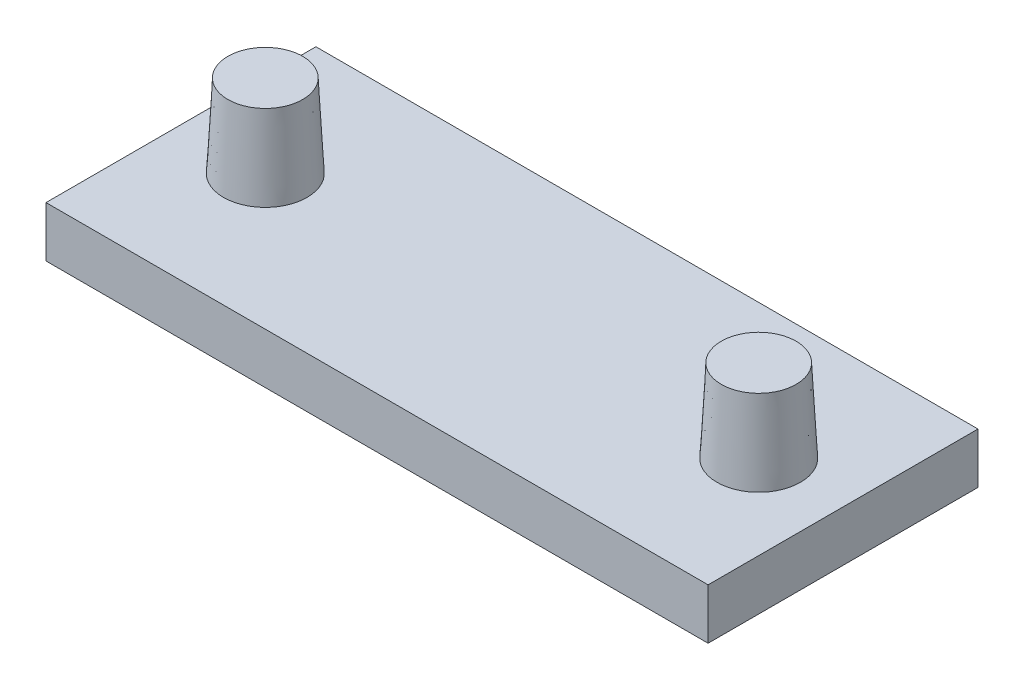
ISO-10303-21;
HEADER;
FILE_DESCRIPTION(('STEP AP214'),'2;1');
FILE_NAME('part.step','',(''),(''),'','','');
FILE_SCHEMA(('AUTOMOTIVE_DESIGN { 1 0 10303 214 1 1 1 1 }'));
ENDSEC;
DATA;
#1=APPLICATION_CONTEXT('core data for automotive mechanical design processes');
#2=APPLICATION_PROTOCOL_DEFINITION('international standard','automotive_design',2000,#1);
#3=PRODUCT_CONTEXT('',#1,'mechanical');
#4=PRODUCT('Part','Part','',(#3));
#5=PRODUCT_RELATED_PRODUCT_CATEGORY('part','',(#4));
#6=PRODUCT_DEFINITION_FORMATION('','',#4);
#7=PRODUCT_DEFINITION_CONTEXT('part definition',#1,'design');
#8=PRODUCT_DEFINITION('design','',#6,#7);
#9=PRODUCT_DEFINITION_SHAPE('','',#8);
#10=(LENGTH_UNIT() NAMED_UNIT(*) SI_UNIT(.MILLI.,.METRE.));
#11=(NAMED_UNIT(*) PLANE_ANGLE_UNIT() SI_UNIT($,.RADIAN.));
#12=(NAMED_UNIT(*) SI_UNIT($,.STERADIAN.) SOLID_ANGLE_UNIT());
#13=UNCERTAINTY_MEASURE_WITH_UNIT(LENGTH_MEASURE(1.E-05),#10,'distance_accuracy_value','');
#14=(GEOMETRIC_REPRESENTATION_CONTEXT(3) GLOBAL_UNCERTAINTY_ASSIGNED_CONTEXT((#13)) GLOBAL_UNIT_ASSIGNED_CONTEXT((#10,
#11,#12)) REPRESENTATION_CONTEXT('',''));
#15=CARTESIAN_POINT('',(0.,0.,0.));
#16=DIRECTION('',(0.,0.,1.));
#17=DIRECTION('',(1.,0.,0.));
#18=AXIS2_PLACEMENT_3D('',#15,#16,#17);
#19=CARTESIAN_POINT('',(-4.17338691038083,3.,2.89774806999235));
#20=DIRECTION('',(1.,0.,0.));
#21=DIRECTION('',(0.,0.,-1.));
#22=AXIS2_PLACEMENT_3D('',#19,#20,#21);
#23=PLANE('',#22);
#24=DIRECTION('',(0.,0.,1.));
#25=VECTOR('',#24,1.);
#26=CARTESIAN_POINT('',(-4.17338691038083,0.,2.89774806999235));
#27=LINE('',#26,#25);
#28=CARTESIAN_POINT('',(-4.17338691038083,0.,-13.1022519300077));
#29=VERTEX_POINT('',#28);
#30=CARTESIAN_POINT('',(-4.17338691038083,0.,2.89774806999235));
#31=VERTEX_POINT('',#30);
#32=EDGE_CURVE('E101',#29,#31,#27,.T.);
#33=ORIENTED_EDGE('',*,*,#32,.T.);
#34=DIRECTION('',(0.,-1.,0.));
#35=VECTOR('',#34,1.);
#36=CARTESIAN_POINT('',(-4.17338691038083,3.,2.89774806999235));
#37=LINE('',#36,#35);
#38=CARTESIAN_POINT('',(-4.17338691038083,3.,2.89774806999235));
#39=VERTEX_POINT('',#38);
#40=EDGE_CURVE('E92',#39,#31,#37,.T.);
#41=ORIENTED_EDGE('',*,*,#40,.F.);
#42=DIRECTION('',(0.,0.,1.));
#43=VECTOR('',#42,1.);
#44=CARTESIAN_POINT('',(-4.17338691038083,3.,2.89774806999235));
#45=LINE('',#44,#43);
#46=CARTESIAN_POINT('',(-4.17338691038083,3.,-13.1022519300077));
#47=VERTEX_POINT('',#46);
#48=EDGE_CURVE('E86',#47,#39,#45,.T.);
#49=ORIENTED_EDGE('',*,*,#48,.F.);
#50=DIRECTION('',(0.,-1.,0.));
#51=VECTOR('',#50,1.);
#52=CARTESIAN_POINT('',(-4.17338691038083,3.,-13.1022519300077));
#53=LINE('',#52,#51);
#54=EDGE_CURVE('E97',#47,#29,#53,.T.);
#55=ORIENTED_EDGE('',*,*,#54,.T.);
#56=EDGE_LOOP('',(#33,#41,#49,#55));
#57=FACE_BOUND('',#56,.T.);
#58=ADVANCED_FACE('F34',(#57),#23,.F.);
#59=CARTESIAN_POINT('',(-4.17338691038083,3.,2.89774806999235));
#60=DIRECTION('',(0.,0.,-1.));
#61=DIRECTION('',(-1.,0.,0.));
#62=AXIS2_PLACEMENT_3D('',#59,#60,#61);
#63=PLANE('',#62);
#64=DIRECTION('',(1.,0.,0.));
#65=VECTOR('',#64,1.);
#66=CARTESIAN_POINT('',(-4.17338691038083,0.,2.89774806999235));
#67=LINE('',#66,#65);
#68=CARTESIAN_POINT('',(35.0766130896192,0.,2.89774806999235));
#69=VERTEX_POINT('',#68);
#70=EDGE_CURVE('E91',#31,#69,#67,.T.);
#71=ORIENTED_EDGE('',*,*,#70,.T.);
#72=DIRECTION('',(0.,-1.,0.));
#73=VECTOR('',#72,1.);
#74=CARTESIAN_POINT('',(35.0766130896192,3.,2.89774806999235));
#75=LINE('',#74,#73);
#76=CARTESIAN_POINT('',(35.0766130896192,3.,2.89774806999235));
#77=VERTEX_POINT('',#76);
#78=EDGE_CURVE('E89',#77,#69,#75,.T.);
#79=ORIENTED_EDGE('',*,*,#78,.F.);
#80=DIRECTION('',(1.,0.,0.));
#81=VECTOR('',#80,1.);
#82=CARTESIAN_POINT('',(-4.17338691038083,3.,2.89774806999235));
#83=LINE('',#82,#81);
#84=EDGE_CURVE('E81',#39,#77,#83,.T.);
#85=ORIENTED_EDGE('',*,*,#84,.F.);
#86=ORIENTED_EDGE('',*,*,#40,.T.);
#87=EDGE_LOOP('',(#71,#79,#85,#86));
#88=FACE_BOUND('',#87,.T.);
#89=ADVANCED_FACE('F90',(#88),#63,.F.);
#90=CARTESIAN_POINT('',(35.0766130896192,3.,2.89774806999235));
#91=DIRECTION('',(-1.,0.,0.));
#92=DIRECTION('',(0.,0.,1.));
#93=AXIS2_PLACEMENT_3D('',#90,#91,#92);
#94=PLANE('',#93);
#95=DIRECTION('',(0.,0.,-1.));
#96=VECTOR('',#95,1.);
#97=CARTESIAN_POINT('',(35.0766130896192,0.,2.89774806999235));
#98=LINE('',#97,#96);
#99=CARTESIAN_POINT('',(35.0766130896192,0.,-13.1022519300077));
#100=VERTEX_POINT('',#99);
#101=EDGE_CURVE('E67',#69,#100,#98,.T.);
#102=ORIENTED_EDGE('',*,*,#101,.T.);
#103=DIRECTION('',(0.,-1.,0.));
#104=VECTOR('',#103,1.);
#105=CARTESIAN_POINT('',(35.0766130896192,3.,-13.1022519300077));
#106=LINE('',#105,#104);
#107=CARTESIAN_POINT('',(35.0766130896192,3.,-13.1022519300077));
#108=VERTEX_POINT('',#107);
#109=EDGE_CURVE('E93',#108,#100,#106,.T.);
#110=ORIENTED_EDGE('',*,*,#109,.F.);
#111=DIRECTION('',(0.,0.,-1.));
#112=VECTOR('',#111,1.);
#113=CARTESIAN_POINT('',(35.0766130896192,3.,2.89774806999235));
#114=LINE('',#113,#112);
#115=EDGE_CURVE('E84',#77,#108,#114,.T.);
#116=ORIENTED_EDGE('',*,*,#115,.F.);
#117=ORIENTED_EDGE('',*,*,#78,.T.);
#118=EDGE_LOOP('',(#102,#110,#116,#117));
#119=FACE_BOUND('',#118,.T.);
#120=ADVANCED_FACE('F95',(#119),#94,.F.);
#121=CARTESIAN_POINT('',(-4.17338691038083,3.,-13.1022519300077));
#122=DIRECTION('',(0.,0.,1.));
#123=DIRECTION('',(1.,0.,0.));
#124=AXIS2_PLACEMENT_3D('',#121,#122,#123);
#125=PLANE('',#124);
#126=DIRECTION('',(-1.,0.,0.));
#127=VECTOR('',#126,1.);
#128=CARTESIAN_POINT('',(-4.17338691038083,0.,-13.1022519300077));
#129=LINE('',#128,#127);
#130=EDGE_CURVE('E73',#100,#29,#129,.T.);
#131=ORIENTED_EDGE('',*,*,#130,.T.);
#132=ORIENTED_EDGE('',*,*,#54,.F.);
#133=DIRECTION('',(-1.,0.,0.));
#134=VECTOR('',#133,1.);
#135=CARTESIAN_POINT('',(-4.17338691038083,3.,-13.1022519300077));
#136=LINE('',#135,#134);
#137=EDGE_CURVE('E50',#108,#47,#136,.T.);
#138=ORIENTED_EDGE('',*,*,#137,.F.);
#139=ORIENTED_EDGE('',*,*,#109,.T.);
#140=EDGE_LOOP('',(#131,#132,#138,#139));
#141=FACE_BOUND('',#140,.T.);
#142=ADVANCED_FACE('F117',(#141),#125,.F.);
#143=CARTESIAN_POINT('',(0.,3.,0.));
#144=DIRECTION('',(0.,-1.,0.));
#145=DIRECTION('',(0.,0.,-1.));
#146=AXIS2_PLACEMENT_3D('',#143,#144,#145);
#147=PLANE('',#146);
#148=CARTESIAN_POINT('',(30.0766130896192,3.,-5.10225193000765));
#149=DIRECTION('',(0.,-1.,0.));
#150=DIRECTION('',(0.,0.,-1.));
#151=AXIS2_PLACEMENT_3D('',#148,#149,#150);
#152=CIRCLE('',#151,2.47500000000001);
#153=CARTESIAN_POINT('',(30.0766130896192,3.,-7.57725193000766));
#154=VERTEX_POINT('',#153);
#155=EDGE_CURVE('E11',#154,#154,#152,.F.);
#156=ORIENTED_EDGE('',*,*,#155,.F.);
#157=EDGE_LOOP('',(#156));
#158=FACE_BOUND('',#157,.T.);
#159=CARTESIAN_POINT('',(0.826613089619173,3.,-5.10225193000765));
#160=DIRECTION('',(0.,-1.,0.));
#161=DIRECTION('',(0.,0.,-1.));
#162=AXIS2_PLACEMENT_3D('',#159,#160,#161);
#163=CIRCLE('',#162,2.475);
#164=CARTESIAN_POINT('',(0.826613089619173,3.,-7.57725193000765));
#165=VERTEX_POINT('',#164);
#166=EDGE_CURVE('E42',#165,#165,#163,.F.);
#167=ORIENTED_EDGE('',*,*,#166,.F.);
#168=EDGE_LOOP('',(#167));
#169=FACE_BOUND('',#168,.T.);
#170=ORIENTED_EDGE('',*,*,#48,.T.);
#171=ORIENTED_EDGE('',*,*,#84,.T.);
#172=ORIENTED_EDGE('',*,*,#115,.T.);
#173=ORIENTED_EDGE('',*,*,#137,.T.);
#174=EDGE_LOOP('',(#170,#171,#172,#173));
#175=FACE_BOUND('',#174,.T.);
#176=ADVANCED_FACE('F82',(#158,#169,#175),#147,.F.);
#177=CARTESIAN_POINT('',(0.,0.,0.));
#178=DIRECTION('',(0.,-1.,0.));
#179=DIRECTION('',(0.,0.,-1.));
#180=AXIS2_PLACEMENT_3D('',#177,#178,#179);
#181=PLANE('',#180);
#182=ORIENTED_EDGE('',*,*,#32,.F.);
#183=ORIENTED_EDGE('',*,*,#130,.F.);
#184=ORIENTED_EDGE('',*,*,#101,.F.);
#185=ORIENTED_EDGE('',*,*,#70,.F.);
#186=EDGE_LOOP('',(#182,#183,#184,#185));
#187=FACE_BOUND('',#186,.T.);
#188=ADVANCED_FACE('F116',(#187),#181,.T.);
#189=CARTESIAN_POINT('',(0.826613089619173,3.,-5.10225193000765));
#190=DIRECTION('',(0.,-1.,0.));
#191=DIRECTION('',(0.,0.,1.));
#192=AXIS2_PLACEMENT_3D('',#189,#190,#191);
#193=CONICAL_SURFACE('',#192,2.475,0.0523598775598299);
#194=CARTESIAN_POINT('',(0.826613089619173,7.9,-5.10225193000765));
#195=DIRECTION('',(0.,1.,0.));
#196=DIRECTION('',(0.,0.,1.));
#197=AXIS2_PLACEMENT_3D('',#194,#195,#196);
#198=CIRCLE('',#197,2.2182018815131);
#199=CARTESIAN_POINT('',(0.826613089619173,7.9,-2.88405004849455));
#200=VERTEX_POINT('',#199);
#201=EDGE_CURVE('E104',#200,#200,#198,.T.);
#202=ORIENTED_EDGE('',*,*,#201,.F.);
#203=EDGE_LOOP('',(#202));
#204=FACE_BOUND('',#203,.T.);
#205=ORIENTED_EDGE('',*,*,#166,.T.);
#206=EDGE_LOOP('',(#205));
#207=FACE_BOUND('',#206,.T.);
#208=ADVANCED_FACE('F113',(#204,#207),#193,.T.);
#209=CARTESIAN_POINT('',(0.826613089619173,7.9,-5.10225193000765));
#210=DIRECTION('',(0.,1.,0.));
#211=DIRECTION('',(0.,0.,1.));
#212=AXIS2_PLACEMENT_3D('',#209,#210,#211);
#213=PLANE('',#212);
#214=ORIENTED_EDGE('',*,*,#201,.T.);
#215=EDGE_LOOP('',(#214));
#216=FACE_BOUND('',#215,.T.);
#217=ADVANCED_FACE('F147',(#216),#213,.T.);
#218=CARTESIAN_POINT('',(30.0766130896192,3.,-5.10225193000765));
#219=DIRECTION('',(0.,-1.,0.));
#220=DIRECTION('',(0.,0.,1.));
#221=AXIS2_PLACEMENT_3D('',#218,#219,#220);
#222=CONICAL_SURFACE('',#221,2.47500000000001,0.0523598775598299);
#223=CARTESIAN_POINT('',(30.0766130896192,7.9,-5.10225193000765));
#224=DIRECTION('',(0.,1.,0.));
#225=DIRECTION('',(0.,0.,1.));
#226=AXIS2_PLACEMENT_3D('',#223,#224,#225);
#227=CIRCLE('',#226,2.21820188151311);
#228=CARTESIAN_POINT('',(30.0766130896192,7.9,-2.88405004849454));
#229=VERTEX_POINT('',#228);
#230=EDGE_CURVE('E138',#229,#229,#227,.T.);
#231=ORIENTED_EDGE('',*,*,#230,.F.);
#232=EDGE_LOOP('',(#231));
#233=FACE_BOUND('',#232,.T.);
#234=ORIENTED_EDGE('',*,*,#155,.T.);
#235=EDGE_LOOP('',(#234));
#236=FACE_BOUND('',#235,.T.);
#237=ADVANCED_FACE('F144',(#233,#236),#222,.T.);
#238=CARTESIAN_POINT('',(30.0766130896192,7.9,-5.10225193000765));
#239=DIRECTION('',(0.,1.,0.));
#240=DIRECTION('',(0.,0.,1.));
#241=AXIS2_PLACEMENT_3D('',#238,#239,#240);
#242=PLANE('',#241);
#243=ORIENTED_EDGE('',*,*,#230,.T.);
#244=EDGE_LOOP('',(#243));
#245=FACE_BOUND('',#244,.T.);
#246=ADVANCED_FACE('F142',(#245),#242,.T.);
#247=CLOSED_SHELL('',(#58,#89,#120,#142,#176,#188,#208,#217,#237,#246));
#248=MANIFOLD_SOLID_BREP('B2',#247);
#249=ADVANCED_BREP_SHAPE_REPRESENTATION('',(#18,#248),#14);
#250=SHAPE_DEFINITION_REPRESENTATION(#9,#249);
ENDSEC;
END-ISO-10303-21;
